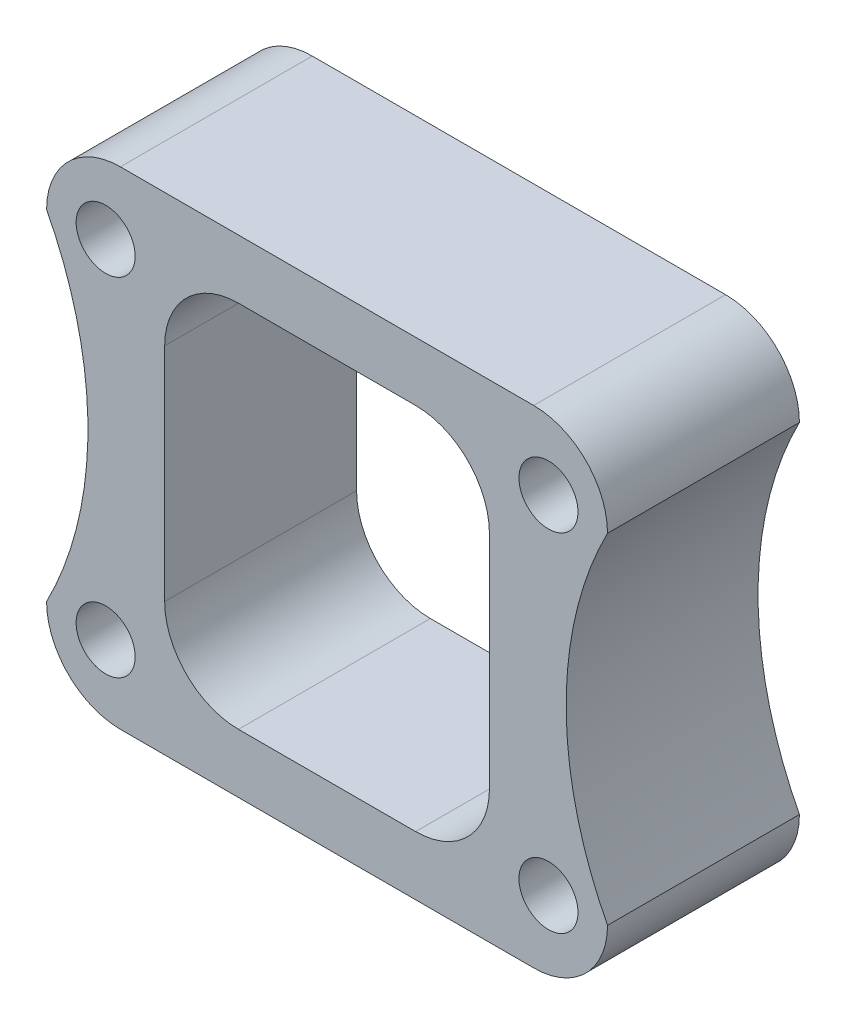
ISO-10303-21;
HEADER;
FILE_DESCRIPTION(('STEP AP214'),'2;1');
FILE_NAME('part.step','',(''),(''),'','','');
FILE_SCHEMA(('AUTOMOTIVE_DESIGN { 1 0 10303 214 1 1 1 1 }'));
ENDSEC;
DATA;
#1=APPLICATION_CONTEXT('core data for automotive mechanical design processes');
#2=APPLICATION_PROTOCOL_DEFINITION('international standard','automotive_design',2000,#1);
#3=PRODUCT_CONTEXT('',#1,'mechanical');
#4=PRODUCT('Part','Part','',(#3));
#5=PRODUCT_RELATED_PRODUCT_CATEGORY('part','',(#4));
#6=PRODUCT_DEFINITION_FORMATION('','',#4);
#7=PRODUCT_DEFINITION_CONTEXT('part definition',#1,'design');
#8=PRODUCT_DEFINITION('design','',#6,#7);
#9=PRODUCT_DEFINITION_SHAPE('','',#8);
#10=(LENGTH_UNIT() NAMED_UNIT(*) SI_UNIT(.MILLI.,.METRE.));
#11=(NAMED_UNIT(*) PLANE_ANGLE_UNIT() SI_UNIT($,.RADIAN.));
#12=(NAMED_UNIT(*) SI_UNIT($,.STERADIAN.) SOLID_ANGLE_UNIT());
#13=UNCERTAINTY_MEASURE_WITH_UNIT(LENGTH_MEASURE(1.E-05),#10,'distance_accuracy_value','');
#14=(GEOMETRIC_REPRESENTATION_CONTEXT(3) GLOBAL_UNCERTAINTY_ASSIGNED_CONTEXT((#13)) GLOBAL_UNIT_ASSIGNED_CONTEXT((#10,
#11,#12)) REPRESENTATION_CONTEXT('',''));
#15=CARTESIAN_POINT('',(0.,0.,0.));
#16=DIRECTION('',(0.,0.,1.));
#17=DIRECTION('',(1.,0.,0.));
#18=AXIS2_PLACEMENT_3D('',#15,#16,#17);
#19=CARTESIAN_POINT('',(5.,28.,13.));
#20=DIRECTION('',(0.,0.,1.));
#21=DIRECTION('',(1.,0.,0.));
#22=AXIS2_PLACEMENT_3D('',#19,#20,#21);
#23=PLANE('',#22);
#24=DIRECTION('',(0.,-1.,0.));
#25=VECTOR('',#24,1.);
#26=CARTESIAN_POINT('',(30.,3.99999999999999,13.));
#27=LINE('',#26,#25);
#28=CARTESIAN_POINT('',(30.,24.,13.));
#29=VERTEX_POINT('',#28);
#30=CARTESIAN_POINT('',(30.,8.99999999999999,13.));
#31=VERTEX_POINT('',#30);
#32=EDGE_CURVE('E229',#29,#31,#27,.T.);
#33=ORIENTED_EDGE('',*,*,#32,.T.);
#34=CARTESIAN_POINT('',(25.,8.99999999999999,13.));
#35=DIRECTION('',(0.,0.,1.));
#36=DIRECTION('',(1.,0.,0.));
#37=AXIS2_PLACEMENT_3D('',#34,#35,#36);
#38=CIRCLE('',#37,5.);
#39=CARTESIAN_POINT('',(25.,3.99999999999999,13.));
#40=VERTEX_POINT('',#39);
#41=EDGE_CURVE('E204',#31,#40,#38,.F.);
#42=ORIENTED_EDGE('',*,*,#41,.T.);
#43=DIRECTION('',(-1.,0.,0.));
#44=VECTOR('',#43,1.);
#45=CARTESIAN_POINT('',(30.,3.99999999999999,13.));
#46=LINE('',#45,#44);
#47=CARTESIAN_POINT('',(13.,4.,13.));
#48=VERTEX_POINT('',#47);
#49=EDGE_CURVE('E235',#40,#48,#46,.T.);
#50=ORIENTED_EDGE('',*,*,#49,.T.);
#51=CARTESIAN_POINT('',(13.,8.99999999999999,13.));
#52=DIRECTION('',(0.,0.,1.));
#53=DIRECTION('',(1.,0.,0.));
#54=AXIS2_PLACEMENT_3D('',#51,#52,#53);
#55=CIRCLE('',#54,5.);
#56=CARTESIAN_POINT('',(8.,8.99999999999999,13.));
#57=VERTEX_POINT('',#56);
#58=EDGE_CURVE('E200',#48,#57,#55,.F.);
#59=ORIENTED_EDGE('',*,*,#58,.T.);
#60=DIRECTION('',(0.,1.,0.));
#61=VECTOR('',#60,1.);
#62=CARTESIAN_POINT('',(8.,4.,13.));
#63=LINE('',#62,#61);
#64=CARTESIAN_POINT('',(8.,24.,13.));
#65=VERTEX_POINT('',#64);
#66=EDGE_CURVE('E230',#57,#65,#63,.T.);
#67=ORIENTED_EDGE('',*,*,#66,.T.);
#68=CARTESIAN_POINT('',(13.,24.,13.));
#69=DIRECTION('',(0.,0.,1.));
#70=DIRECTION('',(1.,0.,0.));
#71=AXIS2_PLACEMENT_3D('',#68,#69,#70);
#72=CIRCLE('',#71,5.);
#73=CARTESIAN_POINT('',(13.,29.,13.));
#74=VERTEX_POINT('',#73);
#75=EDGE_CURVE('E11',#65,#74,#72,.F.);
#76=ORIENTED_EDGE('',*,*,#75,.T.);
#77=DIRECTION('',(1.,0.,0.));
#78=VECTOR('',#77,1.);
#79=CARTESIAN_POINT('',(30.,29.,13.));
#80=LINE('',#79,#78);
#81=CARTESIAN_POINT('',(25.,29.,13.));
#82=VERTEX_POINT('',#81);
#83=EDGE_CURVE('E227',#74,#82,#80,.T.);
#84=ORIENTED_EDGE('',*,*,#83,.T.);
#85=CARTESIAN_POINT('',(25.,24.,13.));
#86=DIRECTION('',(0.,0.,1.));
#87=DIRECTION('',(1.,0.,0.));
#88=AXIS2_PLACEMENT_3D('',#85,#86,#87);
#89=CIRCLE('',#88,5.);
#90=EDGE_CURVE('E208',#82,#29,#89,.F.);
#91=ORIENTED_EDGE('',*,*,#90,.T.);
#92=EDGE_LOOP('',(#33,#42,#50,#59,#67,#76,#84,#91));
#93=FACE_BOUND('',#92,.T.);
#94=CARTESIAN_POINT('',(33.9999999999999,28.25,13.));
#95=DIRECTION('',(0.,0.,1.));
#96=DIRECTION('',(1.,0.,0.));
#97=AXIS2_PLACEMENT_3D('',#94,#95,#96);
#98=CIRCLE('',#97,2.);
#99=CARTESIAN_POINT('',(31.9999999999999,28.25,13.));
#100=VERTEX_POINT('',#99);
#101=EDGE_CURVE('E251',#100,#100,#98,.T.);
#102=ORIENTED_EDGE('',*,*,#101,.F.);
#103=EDGE_LOOP('',(#102));
#104=FACE_BOUND('',#103,.T.);
#105=CARTESIAN_POINT('',(4.,4.75,13.));
#106=DIRECTION('',(0.,0.,1.));
#107=DIRECTION('',(1.,0.,0.));
#108=AXIS2_PLACEMENT_3D('',#105,#106,#107);
#109=CIRCLE('',#108,2.);
#110=CARTESIAN_POINT('',(2.,4.75,13.));
#111=VERTEX_POINT('',#110);
#112=EDGE_CURVE('E263',#111,#111,#109,.T.);
#113=ORIENTED_EDGE('',*,*,#112,.F.);
#114=EDGE_LOOP('',(#113));
#115=FACE_BOUND('',#114,.T.);
#116=CARTESIAN_POINT('',(5.,28.,13.));
#117=DIRECTION('',(0.,0.,1.));
#118=DIRECTION('',(1.,0.,0.));
#119=AXIS2_PLACEMENT_3D('',#116,#117,#118);
#120=CIRCLE('',#119,5.);
#121=CARTESIAN_POINT('',(5.00000000000004,33.,13.));
#122=VERTEX_POINT('',#121);
#123=CARTESIAN_POINT('',(0.,28.,13.));
#124=VERTEX_POINT('',#123);
#125=EDGE_CURVE('E160',#122,#124,#120,.T.);
#126=ORIENTED_EDGE('',*,*,#125,.T.);
#127=CARTESIAN_POINT('',(-22.1979728804231,16.5,13.));
#128=DIRECTION('',(0.,0.,-1.));
#129=DIRECTION('',(-1.,0.,0.));
#130=AXIS2_PLACEMENT_3D('',#127,#128,#129);
#131=CIRCLE('',#130,25.);
#132=CARTESIAN_POINT('',(0.,5.,13.));
#133=VERTEX_POINT('',#132);
#134=EDGE_CURVE('E149',#124,#133,#131,.T.);
#135=ORIENTED_EDGE('',*,*,#134,.T.);
#136=CARTESIAN_POINT('',(5.,5.,13.));
#137=DIRECTION('',(0.,0.,1.));
#138=DIRECTION('',(-1.,0.,0.));
#139=AXIS2_PLACEMENT_3D('',#136,#137,#138);
#140=CIRCLE('',#139,5.);
#141=CARTESIAN_POINT('',(5.00000000000004,0.,13.));
#142=VERTEX_POINT('',#141);
#143=EDGE_CURVE('E159',#133,#142,#140,.T.);
#144=ORIENTED_EDGE('',*,*,#143,.T.);
#145=DIRECTION('',(1.,0.,0.));
#146=VECTOR('',#145,1.);
#147=CARTESIAN_POINT('',(5.00000000000004,0.,13.));
#148=LINE('',#147,#146);
#149=CARTESIAN_POINT('',(33.,0.,13.));
#150=VERTEX_POINT('',#149);
#151=EDGE_CURVE('E269',#142,#150,#148,.T.);
#152=ORIENTED_EDGE('',*,*,#151,.T.);
#153=CARTESIAN_POINT('',(33.,5.,13.));
#154=DIRECTION('',(0.,0.,1.));
#155=DIRECTION('',(-1.,0.,0.));
#156=AXIS2_PLACEMENT_3D('',#153,#154,#155);
#157=CIRCLE('',#156,5.);
#158=CARTESIAN_POINT('',(38.,5.00000000000004,13.));
#159=VERTEX_POINT('',#158);
#160=EDGE_CURVE('E271',#150,#159,#157,.T.);
#161=ORIENTED_EDGE('',*,*,#160,.T.);
#162=CARTESIAN_POINT('',(60.1979728804231,16.5,13.));
#163=DIRECTION('',(0.,0.,-1.));
#164=DIRECTION('',(1.,0.,0.));
#165=AXIS2_PLACEMENT_3D('',#162,#163,#164);
#166=CIRCLE('',#165,25.);
#167=CARTESIAN_POINT('',(38.,28.,13.));
#168=VERTEX_POINT('',#167);
#169=EDGE_CURVE('E273',#159,#168,#166,.T.);
#170=ORIENTED_EDGE('',*,*,#169,.T.);
#171=CARTESIAN_POINT('',(33.,28.,13.));
#172=DIRECTION('',(0.,0.,1.));
#173=DIRECTION('',(1.,0.,0.));
#174=AXIS2_PLACEMENT_3D('',#171,#172,#173);
#175=CIRCLE('',#174,5.);
#176=CARTESIAN_POINT('',(33.,33.,13.));
#177=VERTEX_POINT('',#176);
#178=EDGE_CURVE('E275',#168,#177,#175,.T.);
#179=ORIENTED_EDGE('',*,*,#178,.T.);
#180=DIRECTION('',(-1.,0.,0.));
#181=VECTOR('',#180,1.);
#182=CARTESIAN_POINT('',(5.00000000000004,33.,13.));
#183=LINE('',#182,#181);
#184=EDGE_CURVE('E165',#177,#122,#183,.T.);
#185=ORIENTED_EDGE('',*,*,#184,.T.);
#186=EDGE_LOOP('',(#126,#135,#144,#152,#161,#170,#179,#185));
#187=FACE_BOUND('',#186,.T.);
#188=CARTESIAN_POINT('',(34.,4.75,13.));
#189=DIRECTION('',(0.,0.,1.));
#190=DIRECTION('',(1.,0.,0.));
#191=AXIS2_PLACEMENT_3D('',#188,#189,#190);
#192=CIRCLE('',#191,2.);
#193=CARTESIAN_POINT('',(32.,4.75,13.));
#194=VERTEX_POINT('',#193);
#195=EDGE_CURVE('E257',#194,#194,#192,.T.);
#196=ORIENTED_EDGE('',*,*,#195,.F.);
#197=EDGE_LOOP('',(#196));
#198=FACE_BOUND('',#197,.T.);
#199=CARTESIAN_POINT('',(3.99999999999992,28.25,13.));
#200=DIRECTION('',(0.,0.,1.));
#201=DIRECTION('',(1.,0.,0.));
#202=AXIS2_PLACEMENT_3D('',#199,#200,#201);
#203=CIRCLE('',#202,2.);
#204=CARTESIAN_POINT('',(1.99999999999992,28.25,13.));
#205=VERTEX_POINT('',#204);
#206=EDGE_CURVE('E245',#205,#205,#203,.T.);
#207=ORIENTED_EDGE('',*,*,#206,.F.);
#208=EDGE_LOOP('',(#207));
#209=FACE_BOUND('',#208,.T.);
#210=ADVANCED_FACE('F36',(#93,#104,#115,#187,#198,#209),#23,.T.);
#211=CARTESIAN_POINT('',(5.,28.,0.));
#212=DIRECTION('',(0.,0.,1.));
#213=DIRECTION('',(1.,0.,0.));
#214=AXIS2_PLACEMENT_3D('',#211,#212,#213);
#215=PLANE('',#214);
#216=DIRECTION('',(0.,1.,0.));
#217=VECTOR('',#216,1.);
#218=CARTESIAN_POINT('',(8.,4.,0.));
#219=LINE('',#218,#217);
#220=CARTESIAN_POINT('',(8.,8.99999999999999,0.));
#221=VERTEX_POINT('',#220);
#222=CARTESIAN_POINT('',(8.,24.,0.));
#223=VERTEX_POINT('',#222);
#224=EDGE_CURVE('E215',#221,#223,#219,.T.);
#225=ORIENTED_EDGE('',*,*,#224,.F.);
#226=CARTESIAN_POINT('',(13.,8.99999999999999,0.));
#227=DIRECTION('',(0.,0.,1.));
#228=DIRECTION('',(1.,0.,0.));
#229=AXIS2_PLACEMENT_3D('',#226,#227,#228);
#230=CIRCLE('',#229,5.);
#231=CARTESIAN_POINT('',(13.,4.,0.));
#232=VERTEX_POINT('',#231);
#233=EDGE_CURVE('E198',#221,#232,#230,.T.);
#234=ORIENTED_EDGE('',*,*,#233,.T.);
#235=DIRECTION('',(-1.,0.,0.));
#236=VECTOR('',#235,1.);
#237=CARTESIAN_POINT('',(30.,3.99999999999999,0.));
#238=LINE('',#237,#236);
#239=CARTESIAN_POINT('',(25.,3.99999999999999,0.));
#240=VERTEX_POINT('',#239);
#241=EDGE_CURVE('E224',#240,#232,#238,.T.);
#242=ORIENTED_EDGE('',*,*,#241,.F.);
#243=CARTESIAN_POINT('',(25.,8.99999999999999,0.));
#244=DIRECTION('',(0.,0.,1.));
#245=DIRECTION('',(1.,0.,0.));
#246=AXIS2_PLACEMENT_3D('',#243,#244,#245);
#247=CIRCLE('',#246,5.);
#248=CARTESIAN_POINT('',(30.,8.99999999999999,0.));
#249=VERTEX_POINT('',#248);
#250=EDGE_CURVE('E202',#240,#249,#247,.T.);
#251=ORIENTED_EDGE('',*,*,#250,.T.);
#252=DIRECTION('',(0.,-1.,0.));
#253=VECTOR('',#252,1.);
#254=CARTESIAN_POINT('',(30.,3.99999999999999,0.));
#255=LINE('',#254,#253);
#256=CARTESIAN_POINT('',(30.,24.,0.));
#257=VERTEX_POINT('',#256);
#258=EDGE_CURVE('E242',#257,#249,#255,.T.);
#259=ORIENTED_EDGE('',*,*,#258,.F.);
#260=CARTESIAN_POINT('',(25.,24.,0.));
#261=DIRECTION('',(0.,0.,1.));
#262=DIRECTION('',(1.,0.,0.));
#263=AXIS2_PLACEMENT_3D('',#260,#261,#262);
#264=CIRCLE('',#263,5.);
#265=CARTESIAN_POINT('',(25.,29.,0.));
#266=VERTEX_POINT('',#265);
#267=EDGE_CURVE('E206',#257,#266,#264,.T.);
#268=ORIENTED_EDGE('',*,*,#267,.T.);
#269=DIRECTION('',(1.,0.,0.));
#270=VECTOR('',#269,1.);
#271=CARTESIAN_POINT('',(30.,29.,0.));
#272=LINE('',#271,#270);
#273=CARTESIAN_POINT('',(13.,29.,0.));
#274=VERTEX_POINT('',#273);
#275=EDGE_CURVE('E216',#274,#266,#272,.T.);
#276=ORIENTED_EDGE('',*,*,#275,.F.);
#277=CARTESIAN_POINT('',(13.,24.,0.));
#278=DIRECTION('',(0.,0.,1.));
#279=DIRECTION('',(1.,0.,0.));
#280=AXIS2_PLACEMENT_3D('',#277,#278,#279);
#281=CIRCLE('',#280,5.);
#282=EDGE_CURVE('E44',#274,#223,#281,.T.);
#283=ORIENTED_EDGE('',*,*,#282,.T.);
#284=EDGE_LOOP('',(#225,#234,#242,#251,#259,#268,#276,#283));
#285=FACE_BOUND('',#284,.T.);
#286=CARTESIAN_POINT('',(5.,28.,0.));
#287=DIRECTION('',(0.,0.,1.));
#288=DIRECTION('',(1.,0.,0.));
#289=AXIS2_PLACEMENT_3D('',#286,#287,#288);
#290=CIRCLE('',#289,5.);
#291=CARTESIAN_POINT('',(5.00000000000004,33.,0.));
#292=VERTEX_POINT('',#291);
#293=CARTESIAN_POINT('',(0.,28.,0.));
#294=VERTEX_POINT('',#293);
#295=EDGE_CURVE('E173',#292,#294,#290,.T.);
#296=ORIENTED_EDGE('',*,*,#295,.F.);
#297=DIRECTION('',(-1.,0.,0.));
#298=VECTOR('',#297,1.);
#299=CARTESIAN_POINT('',(5.00000000000004,33.,0.));
#300=LINE('',#299,#298);
#301=CARTESIAN_POINT('',(33.,33.,0.));
#302=VERTEX_POINT('',#301);
#303=EDGE_CURVE('E169',#302,#292,#300,.T.);
#304=ORIENTED_EDGE('',*,*,#303,.F.);
#305=CARTESIAN_POINT('',(33.,28.,0.));
#306=DIRECTION('',(0.,0.,1.));
#307=DIRECTION('',(1.,0.,0.));
#308=AXIS2_PLACEMENT_3D('',#305,#306,#307);
#309=CIRCLE('',#308,5.);
#310=CARTESIAN_POINT('',(38.,28.,0.));
#311=VERTEX_POINT('',#310);
#312=EDGE_CURVE('E290',#311,#302,#309,.T.);
#313=ORIENTED_EDGE('',*,*,#312,.F.);
#314=CARTESIAN_POINT('',(60.1979728804231,16.5,0.));
#315=DIRECTION('',(0.,0.,-1.));
#316=DIRECTION('',(1.,0.,0.));
#317=AXIS2_PLACEMENT_3D('',#314,#315,#316);
#318=CIRCLE('',#317,25.);
#319=CARTESIAN_POINT('',(38.,5.00000000000004,0.));
#320=VERTEX_POINT('',#319);
#321=EDGE_CURVE('E288',#320,#311,#318,.T.);
#322=ORIENTED_EDGE('',*,*,#321,.F.);
#323=CARTESIAN_POINT('',(33.,5.,0.));
#324=DIRECTION('',(0.,0.,1.));
#325=DIRECTION('',(-1.,0.,0.));
#326=AXIS2_PLACEMENT_3D('',#323,#324,#325);
#327=CIRCLE('',#326,5.);
#328=CARTESIAN_POINT('',(33.,0.,0.));
#329=VERTEX_POINT('',#328);
#330=EDGE_CURVE('E286',#329,#320,#327,.T.);
#331=ORIENTED_EDGE('',*,*,#330,.F.);
#332=DIRECTION('',(1.,0.,0.));
#333=VECTOR('',#332,1.);
#334=CARTESIAN_POINT('',(5.00000000000004,0.,0.));
#335=LINE('',#334,#333);
#336=CARTESIAN_POINT('',(5.00000000000004,0.,0.));
#337=VERTEX_POINT('',#336);
#338=EDGE_CURVE('E284',#337,#329,#335,.T.);
#339=ORIENTED_EDGE('',*,*,#338,.F.);
#340=CARTESIAN_POINT('',(5.,5.,0.));
#341=DIRECTION('',(0.,0.,1.));
#342=DIRECTION('',(-1.,0.,0.));
#343=AXIS2_PLACEMENT_3D('',#340,#341,#342);
#344=CIRCLE('',#343,5.);
#345=CARTESIAN_POINT('',(0.,5.,0.));
#346=VERTEX_POINT('',#345);
#347=EDGE_CURVE('E282',#346,#337,#344,.T.);
#348=ORIENTED_EDGE('',*,*,#347,.F.);
#349=CARTESIAN_POINT('',(-22.1979728804231,16.5,0.));
#350=DIRECTION('',(0.,0.,-1.));
#351=DIRECTION('',(-1.,0.,0.));
#352=AXIS2_PLACEMENT_3D('',#349,#350,#351);
#353=CIRCLE('',#352,25.);
#354=EDGE_CURVE('E280',#294,#346,#353,.T.);
#355=ORIENTED_EDGE('',*,*,#354,.F.);
#356=EDGE_LOOP('',(#296,#304,#313,#322,#331,#339,#348,#355));
#357=FACE_BOUND('',#356,.T.);
#358=CARTESIAN_POINT('',(4.,4.75,0.));
#359=DIRECTION('',(0.,0.,1.));
#360=DIRECTION('',(1.,0.,0.));
#361=AXIS2_PLACEMENT_3D('',#358,#359,#360);
#362=CIRCLE('',#361,2.);
#363=CARTESIAN_POINT('',(2.,4.75,0.));
#364=VERTEX_POINT('',#363);
#365=EDGE_CURVE('E260',#364,#364,#362,.T.);
#366=ORIENTED_EDGE('',*,*,#365,.T.);
#367=EDGE_LOOP('',(#366));
#368=FACE_BOUND('',#367,.T.);
#369=CARTESIAN_POINT('',(34.,4.75,0.));
#370=DIRECTION('',(0.,0.,1.));
#371=DIRECTION('',(1.,0.,0.));
#372=AXIS2_PLACEMENT_3D('',#369,#370,#371);
#373=CIRCLE('',#372,2.);
#374=CARTESIAN_POINT('',(32.,4.75,0.));
#375=VERTEX_POINT('',#374);
#376=EDGE_CURVE('E254',#375,#375,#373,.T.);
#377=ORIENTED_EDGE('',*,*,#376,.T.);
#378=EDGE_LOOP('',(#377));
#379=FACE_BOUND('',#378,.T.);
#380=CARTESIAN_POINT('',(33.9999999999999,28.25,0.));
#381=DIRECTION('',(0.,0.,1.));
#382=DIRECTION('',(1.,0.,0.));
#383=AXIS2_PLACEMENT_3D('',#380,#381,#382);
#384=CIRCLE('',#383,2.);
#385=CARTESIAN_POINT('',(31.9999999999999,28.25,0.));
#386=VERTEX_POINT('',#385);
#387=EDGE_CURVE('E248',#386,#386,#384,.T.);
#388=ORIENTED_EDGE('',*,*,#387,.T.);
#389=EDGE_LOOP('',(#388));
#390=FACE_BOUND('',#389,.T.);
#391=CARTESIAN_POINT('',(3.99999999999992,28.25,0.));
#392=DIRECTION('',(0.,0.,1.));
#393=DIRECTION('',(1.,0.,0.));
#394=AXIS2_PLACEMENT_3D('',#391,#392,#393);
#395=CIRCLE('',#394,2.);
#396=CARTESIAN_POINT('',(1.99999999999992,28.25,0.));
#397=VERTEX_POINT('',#396);
#398=EDGE_CURVE('E233',#397,#397,#395,.T.);
#399=ORIENTED_EDGE('',*,*,#398,.T.);
#400=EDGE_LOOP('',(#399));
#401=FACE_BOUND('',#400,.T.);
#402=ADVANCED_FACE('F213',(#285,#357,#368,#379,#390,#401),#215,.F.);
#403=CARTESIAN_POINT('',(5.,28.,13.));
#404=DIRECTION('',(0.,0.,-1.));
#405=DIRECTION('',(-1.,0.,0.));
#406=AXIS2_PLACEMENT_3D('',#403,#404,#405);
#407=CYLINDRICAL_SURFACE('',#406,5.);
#408=ORIENTED_EDGE('',*,*,#295,.T.);
#409=DIRECTION('',(0.,0.,-1.));
#410=VECTOR('',#409,1.);
#411=CARTESIAN_POINT('',(0.,28.,13.));
#412=LINE('',#411,#410);
#413=EDGE_CURVE('E153',#124,#294,#412,.T.);
#414=ORIENTED_EDGE('',*,*,#413,.F.);
#415=ORIENTED_EDGE('',*,*,#125,.F.);
#416=DIRECTION('',(0.,0.,-1.));
#417=VECTOR('',#416,1.);
#418=CARTESIAN_POINT('',(5.00000000000004,33.,13.));
#419=LINE('',#418,#417);
#420=EDGE_CURVE('E278',#122,#292,#419,.T.);
#421=ORIENTED_EDGE('',*,*,#420,.T.);
#422=EDGE_LOOP('',(#408,#414,#415,#421));
#423=FACE_BOUND('',#422,.T.);
#424=ADVANCED_FACE('F171',(#423),#407,.T.);
#425=CARTESIAN_POINT('',(-22.1979728804231,16.5,13.));
#426=DIRECTION('',(0.,0.,-1.));
#427=DIRECTION('',(-1.,0.,0.));
#428=AXIS2_PLACEMENT_3D('',#425,#426,#427);
#429=CYLINDRICAL_SURFACE('',#428,25.);
#430=ORIENTED_EDGE('',*,*,#354,.T.);
#431=DIRECTION('',(0.,0.,-1.));
#432=VECTOR('',#431,1.);
#433=CARTESIAN_POINT('',(0.,5.,13.));
#434=LINE('',#433,#432);
#435=EDGE_CURVE('E156',#133,#346,#434,.T.);
#436=ORIENTED_EDGE('',*,*,#435,.F.);
#437=ORIENTED_EDGE('',*,*,#134,.F.);
#438=ORIENTED_EDGE('',*,*,#413,.T.);
#439=EDGE_LOOP('',(#430,#436,#437,#438));
#440=FACE_BOUND('',#439,.T.);
#441=ADVANCED_FACE('F151',(#440),#429,.F.);
#442=CARTESIAN_POINT('',(5.,5.,13.));
#443=DIRECTION('',(0.,0.,-1.));
#444=DIRECTION('',(-1.,0.,0.));
#445=AXIS2_PLACEMENT_3D('',#442,#443,#444);
#446=CYLINDRICAL_SURFACE('',#445,5.);
#447=ORIENTED_EDGE('',*,*,#347,.T.);
#448=DIRECTION('',(0.,0.,-1.));
#449=VECTOR('',#448,1.);
#450=CARTESIAN_POINT('',(5.00000000000004,0.,13.));
#451=LINE('',#450,#449);
#452=EDGE_CURVE('E178',#142,#337,#451,.T.);
#453=ORIENTED_EDGE('',*,*,#452,.F.);
#454=ORIENTED_EDGE('',*,*,#143,.F.);
#455=ORIENTED_EDGE('',*,*,#435,.T.);
#456=EDGE_LOOP('',(#447,#453,#454,#455));
#457=FACE_BOUND('',#456,.T.);
#458=ADVANCED_FACE('F328',(#457),#446,.T.);
#459=CARTESIAN_POINT('',(5.00000000000004,0.,13.));
#460=DIRECTION('',(0.,1.,0.));
#461=DIRECTION('',(0.,0.,1.));
#462=AXIS2_PLACEMENT_3D('',#459,#460,#461);
#463=PLANE('',#462);
#464=ORIENTED_EDGE('',*,*,#338,.T.);
#465=DIRECTION('',(0.,0.,-1.));
#466=VECTOR('',#465,1.);
#467=CARTESIAN_POINT('',(33.,0.,13.));
#468=LINE('',#467,#466);
#469=EDGE_CURVE('E303',#150,#329,#468,.T.);
#470=ORIENTED_EDGE('',*,*,#469,.F.);
#471=ORIENTED_EDGE('',*,*,#151,.F.);
#472=ORIENTED_EDGE('',*,*,#452,.T.);
#473=EDGE_LOOP('',(#464,#470,#471,#472));
#474=FACE_BOUND('',#473,.T.);
#475=ADVANCED_FACE('F310',(#474),#463,.F.);
#476=CARTESIAN_POINT('',(33.,5.,13.));
#477=DIRECTION('',(0.,0.,-1.));
#478=DIRECTION('',(-1.,0.,0.));
#479=AXIS2_PLACEMENT_3D('',#476,#477,#478);
#480=CYLINDRICAL_SURFACE('',#479,5.);
#481=ORIENTED_EDGE('',*,*,#330,.T.);
#482=DIRECTION('',(0.,0.,-1.));
#483=VECTOR('',#482,1.);
#484=CARTESIAN_POINT('',(38.,5.00000000000004,13.));
#485=LINE('',#484,#483);
#486=EDGE_CURVE('E300',#159,#320,#485,.T.);
#487=ORIENTED_EDGE('',*,*,#486,.F.);
#488=ORIENTED_EDGE('',*,*,#160,.F.);
#489=ORIENTED_EDGE('',*,*,#469,.T.);
#490=EDGE_LOOP('',(#481,#487,#488,#489));
#491=FACE_BOUND('',#490,.T.);
#492=ADVANCED_FACE('F320',(#491),#480,.T.);
#493=CARTESIAN_POINT('',(60.1979728804231,16.5,13.));
#494=DIRECTION('',(0.,0.,-1.));
#495=DIRECTION('',(-1.,0.,0.));
#496=AXIS2_PLACEMENT_3D('',#493,#494,#495);
#497=CYLINDRICAL_SURFACE('',#496,25.);
#498=ORIENTED_EDGE('',*,*,#321,.T.);
#499=DIRECTION('',(0.,0.,-1.));
#500=VECTOR('',#499,1.);
#501=CARTESIAN_POINT('',(38.,28.,13.));
#502=LINE('',#501,#500);
#503=EDGE_CURVE('E297',#168,#311,#502,.T.);
#504=ORIENTED_EDGE('',*,*,#503,.F.);
#505=ORIENTED_EDGE('',*,*,#169,.F.);
#506=ORIENTED_EDGE('',*,*,#486,.T.);
#507=EDGE_LOOP('',(#498,#504,#505,#506));
#508=FACE_BOUND('',#507,.T.);
#509=ADVANCED_FACE('F324',(#508),#497,.F.);
#510=CARTESIAN_POINT('',(33.,28.,13.));
#511=DIRECTION('',(0.,0.,-1.));
#512=DIRECTION('',(-1.,0.,0.));
#513=AXIS2_PLACEMENT_3D('',#510,#511,#512);
#514=CYLINDRICAL_SURFACE('',#513,5.);
#515=ORIENTED_EDGE('',*,*,#312,.T.);
#516=DIRECTION('',(0.,0.,-1.));
#517=VECTOR('',#516,1.);
#518=CARTESIAN_POINT('',(33.,33.,13.));
#519=LINE('',#518,#517);
#520=EDGE_CURVE('E294',#177,#302,#519,.T.);
#521=ORIENTED_EDGE('',*,*,#520,.F.);
#522=ORIENTED_EDGE('',*,*,#178,.F.);
#523=ORIENTED_EDGE('',*,*,#503,.T.);
#524=EDGE_LOOP('',(#515,#521,#522,#523));
#525=FACE_BOUND('',#524,.T.);
#526=ADVANCED_FACE('F351',(#525),#514,.T.);
#527=CARTESIAN_POINT('',(5.00000000000004,33.,13.));
#528=DIRECTION('',(0.,-1.,0.));
#529=DIRECTION('',(0.,0.,-1.));
#530=AXIS2_PLACEMENT_3D('',#527,#528,#529);
#531=PLANE('',#530);
#532=ORIENTED_EDGE('',*,*,#303,.T.);
#533=ORIENTED_EDGE('',*,*,#420,.F.);
#534=ORIENTED_EDGE('',*,*,#184,.F.);
#535=ORIENTED_EDGE('',*,*,#520,.T.);
#536=EDGE_LOOP('',(#532,#533,#534,#535));
#537=FACE_BOUND('',#536,.T.);
#538=ADVANCED_FACE('F348',(#537),#531,.F.);
#539=CARTESIAN_POINT('',(4.,4.75,13.));
#540=DIRECTION('',(0.,0.,-1.));
#541=DIRECTION('',(-1.,0.,0.));
#542=AXIS2_PLACEMENT_3D('',#539,#540,#541);
#543=CYLINDRICAL_SURFACE('',#542,2.);
#544=CARTESIAN_POINT('',(2.,4.75,13.));
#545=CARTESIAN_POINT('',(2.,4.75,12.8645833333333));
#546=CARTESIAN_POINT('',(2.,4.75,12.7291666666667));
#547=CARTESIAN_POINT('',(2.,4.75,12.4583333333333));
#548=CARTESIAN_POINT('',(2.,4.75,12.3229166666667));
#549=CARTESIAN_POINT('',(2.,4.75,12.0520833333333));
#550=CARTESIAN_POINT('',(2.,4.75,11.9166666666667));
#551=CARTESIAN_POINT('',(2.,4.75,11.6458333333333));
#552=CARTESIAN_POINT('',(2.,4.75,11.5104166666667));
#553=CARTESIAN_POINT('',(2.,4.75,11.2395833333333));
#554=CARTESIAN_POINT('',(2.,4.75,11.1041666666667));
#555=CARTESIAN_POINT('',(2.,4.75,10.8333333333333));
#556=CARTESIAN_POINT('',(2.,4.75,10.6979166666667));
#557=CARTESIAN_POINT('',(2.,4.75,10.4270833333333));
#558=CARTESIAN_POINT('',(2.,4.75,10.2916666666667));
#559=CARTESIAN_POINT('',(2.,4.75,10.0208333333333));
#560=CARTESIAN_POINT('',(2.,4.75,9.88541666666667));
#561=CARTESIAN_POINT('',(2.,4.75,9.61458333333333));
#562=CARTESIAN_POINT('',(2.,4.75,9.47916666666667));
#563=CARTESIAN_POINT('',(2.,4.75,9.20833333333333));
#564=CARTESIAN_POINT('',(2.,4.75,9.07291666666666));
#565=CARTESIAN_POINT('',(2.,4.75,8.80208333333333));
#566=CARTESIAN_POINT('',(2.,4.75,8.66666666666667));
#567=CARTESIAN_POINT('',(2.,4.75,8.39583333333333));
#568=CARTESIAN_POINT('',(2.,4.75,8.26041666666667));
#569=CARTESIAN_POINT('',(2.,4.75,7.98958333333333));
#570=CARTESIAN_POINT('',(2.,4.75,7.85416666666667));
#571=CARTESIAN_POINT('',(2.,4.75,7.58333333333333));
#572=CARTESIAN_POINT('',(2.,4.75,7.44791666666667));
#573=CARTESIAN_POINT('',(2.,4.75,7.17708333333333));
#574=CARTESIAN_POINT('',(2.,4.75,7.04166666666667));
#575=CARTESIAN_POINT('',(2.,4.75,6.77083333333333));
#576=CARTESIAN_POINT('',(2.,4.75,6.63541666666667));
#577=CARTESIAN_POINT('',(2.,4.75,6.36458333333333));
#578=CARTESIAN_POINT('',(2.,4.75,6.22916666666667));
#579=CARTESIAN_POINT('',(2.,4.75,5.95833333333333));
#580=CARTESIAN_POINT('',(2.,4.75,5.82291666666667));
#581=CARTESIAN_POINT('',(2.,4.75,5.55208333333333));
#582=CARTESIAN_POINT('',(2.,4.75,5.41666666666667));
#583=CARTESIAN_POINT('',(2.,4.75,5.14583333333333));
#584=CARTESIAN_POINT('',(2.,4.75,5.01041666666667));
#585=CARTESIAN_POINT('',(2.,4.75,4.73958333333333));
#586=CARTESIAN_POINT('',(2.,4.75,4.60416666666667));
#587=CARTESIAN_POINT('',(2.,4.75,4.33333333333333));
#588=CARTESIAN_POINT('',(2.,4.75,4.19791666666667));
#589=CARTESIAN_POINT('',(2.,4.75,3.92708333333333));
#590=CARTESIAN_POINT('',(2.,4.75,3.79166666666667));
#591=CARTESIAN_POINT('',(2.,4.75,3.52083333333333));
#592=CARTESIAN_POINT('',(2.,4.75,3.38541666666667));
#593=CARTESIAN_POINT('',(2.,4.75,3.11458333333333));
#594=CARTESIAN_POINT('',(2.,4.75,2.97916666666667));
#595=CARTESIAN_POINT('',(2.,4.75,2.70833333333333));
#596=CARTESIAN_POINT('',(2.,4.75,2.57291666666667));
#597=CARTESIAN_POINT('',(2.,4.75,2.30208333333333));
#598=CARTESIAN_POINT('',(2.,4.75,2.16666666666667));
#599=CARTESIAN_POINT('',(2.,4.75,1.89583333333333));
#600=CARTESIAN_POINT('',(2.,4.75,1.76041666666667));
#601=CARTESIAN_POINT('',(2.,4.75,1.48958333333333));
#602=CARTESIAN_POINT('',(2.,4.75,1.35416666666667));
#603=CARTESIAN_POINT('',(2.,4.75,1.08333333333333));
#604=CARTESIAN_POINT('',(2.,4.75,0.947916666666667));
#605=CARTESIAN_POINT('',(2.,4.75,0.677083333333334));
#606=CARTESIAN_POINT('',(2.,4.75,0.541666666666667));
#607=CARTESIAN_POINT('',(2.,4.75,0.270833333333334));
#608=CARTESIAN_POINT('',(2.,4.75,0.135416666666667));
#609=CARTESIAN_POINT('',(2.,4.75,0.));
#610=B_SPLINE_CURVE_WITH_KNOTS('',3,(#544,#545,#546,#547,#548,#549,#550,#551,#552,#553,#554,
#555,#556,#557,#558,#559,#560,#561,#562,#563,#564,#565,#566,#567,#568,#569,#570,#571,#572,#573,
#574,#575,#576,#577,#578,#579,#580,#581,#582,#583,#584,#585,#586,#587,#588,#589,#590,#591,#592,
#593,#594,#595,#596,#597,#598,#599,#600,#601,#602,#603,#604,#605,#606,#607,#608,#609),
.UNSPECIFIED.,.F.,.F.,(4,2,2,2,2,2,2,2,2,2,2,2,2,2,2,2,2,2,2,2,2,2,2,2,2,2,2,2,2,2,2,2,4),(0.,
0.40625,0.812500000000001,1.21875,1.625,2.03125,2.4375,2.84375,3.25,3.65625,4.0625,4.46875,
4.875,5.28125,5.6875,6.09375,6.5,6.90625,7.3125,7.71875,8.125,8.53125,8.9375,9.34375,9.75,
10.15625,10.5625,10.96875,11.375,11.78125,12.1875,12.59375,13.),.UNSPECIFIED.);
#611=EDGE_CURVE('BSEAM345',#111,#364,#610,.T.);
#612=ORIENTED_EDGE('',*,*,#112,.T.);
#613=ORIENTED_EDGE('',*,*,#365,.F.);
#614=ORIENTED_EDGE('',*,*,#611,.T.);
#615=ORIENTED_EDGE('',*,*,#611,.F.);
#616=EDGE_LOOP('',(#612,#614,#613,#615));
#617=FACE_BOUND('',#616,.T.);
#618=ADVANCED_FACE('F345',(#617),#543,.F.);
#619=CARTESIAN_POINT('',(34.,4.75,13.));
#620=DIRECTION('',(0.,0.,-1.));
#621=DIRECTION('',(-1.,0.,0.));
#622=AXIS2_PLACEMENT_3D('',#619,#620,#621);
#623=CYLINDRICAL_SURFACE('',#622,2.);
#624=CARTESIAN_POINT('',(32.,4.75,13.));
#625=CARTESIAN_POINT('',(32.,4.75,12.8645833333333));
#626=CARTESIAN_POINT('',(32.,4.75,12.7291666666667));
#627=CARTESIAN_POINT('',(32.,4.75,12.4583333333333));
#628=CARTESIAN_POINT('',(32.,4.75,12.3229166666667));
#629=CARTESIAN_POINT('',(32.,4.75,12.0520833333333));
#630=CARTESIAN_POINT('',(32.,4.75,11.9166666666667));
#631=CARTESIAN_POINT('',(32.,4.75,11.6458333333333));
#632=CARTESIAN_POINT('',(32.,4.75,11.5104166666667));
#633=CARTESIAN_POINT('',(32.,4.75,11.2395833333333));
#634=CARTESIAN_POINT('',(32.,4.75,11.1041666666667));
#635=CARTESIAN_POINT('',(32.,4.75,10.8333333333333));
#636=CARTESIAN_POINT('',(32.,4.75,10.6979166666667));
#637=CARTESIAN_POINT('',(32.,4.75,10.4270833333333));
#638=CARTESIAN_POINT('',(32.,4.75,10.2916666666667));
#639=CARTESIAN_POINT('',(32.,4.75,10.0208333333333));
#640=CARTESIAN_POINT('',(32.,4.75,9.88541666666667));
#641=CARTESIAN_POINT('',(32.,4.75,9.61458333333333));
#642=CARTESIAN_POINT('',(32.,4.75,9.47916666666667));
#643=CARTESIAN_POINT('',(32.,4.75,9.20833333333333));
#644=CARTESIAN_POINT('',(32.,4.75,9.07291666666666));
#645=CARTESIAN_POINT('',(32.,4.75,8.80208333333333));
#646=CARTESIAN_POINT('',(32.,4.75,8.66666666666667));
#647=CARTESIAN_POINT('',(32.,4.75,8.39583333333333));
#648=CARTESIAN_POINT('',(32.,4.75,8.26041666666667));
#649=CARTESIAN_POINT('',(32.,4.75,7.98958333333333));
#650=CARTESIAN_POINT('',(32.,4.75,7.85416666666667));
#651=CARTESIAN_POINT('',(32.,4.75,7.58333333333333));
#652=CARTESIAN_POINT('',(32.,4.75,7.44791666666667));
#653=CARTESIAN_POINT('',(32.,4.75,7.17708333333333));
#654=CARTESIAN_POINT('',(32.,4.75,7.04166666666667));
#655=CARTESIAN_POINT('',(32.,4.75,6.77083333333333));
#656=CARTESIAN_POINT('',(32.,4.75,6.63541666666667));
#657=CARTESIAN_POINT('',(32.,4.75,6.36458333333333));
#658=CARTESIAN_POINT('',(32.,4.75,6.22916666666667));
#659=CARTESIAN_POINT('',(32.,4.75,5.95833333333333));
#660=CARTESIAN_POINT('',(32.,4.75,5.82291666666667));
#661=CARTESIAN_POINT('',(32.,4.75,5.55208333333333));
#662=CARTESIAN_POINT('',(32.,4.75,5.41666666666667));
#663=CARTESIAN_POINT('',(32.,4.75,5.14583333333333));
#664=CARTESIAN_POINT('',(32.,4.75,5.01041666666667));
#665=CARTESIAN_POINT('',(32.,4.75,4.73958333333333));
#666=CARTESIAN_POINT('',(32.,4.75,4.60416666666667));
#667=CARTESIAN_POINT('',(32.,4.75,4.33333333333333));
#668=CARTESIAN_POINT('',(32.,4.75,4.19791666666667));
#669=CARTESIAN_POINT('',(32.,4.75,3.92708333333333));
#670=CARTESIAN_POINT('',(32.,4.75,3.79166666666667));
#671=CARTESIAN_POINT('',(32.,4.75,3.52083333333333));
#672=CARTESIAN_POINT('',(32.,4.75,3.38541666666667));
#673=CARTESIAN_POINT('',(32.,4.75,3.11458333333333));
#674=CARTESIAN_POINT('',(32.,4.75,2.97916666666667));
#675=CARTESIAN_POINT('',(32.,4.75,2.70833333333333));
#676=CARTESIAN_POINT('',(32.,4.75,2.57291666666667));
#677=CARTESIAN_POINT('',(32.,4.75,2.30208333333333));
#678=CARTESIAN_POINT('',(32.,4.75,2.16666666666667));
#679=CARTESIAN_POINT('',(32.,4.75,1.89583333333333));
#680=CARTESIAN_POINT('',(32.,4.75,1.76041666666667));
#681=CARTESIAN_POINT('',(32.,4.75,1.48958333333333));
#682=CARTESIAN_POINT('',(32.,4.75,1.35416666666667));
#683=CARTESIAN_POINT('',(32.,4.75,1.08333333333333));
#684=CARTESIAN_POINT('',(32.,4.75,0.947916666666667));
#685=CARTESIAN_POINT('',(32.,4.75,0.677083333333334));
#686=CARTESIAN_POINT('',(32.,4.75,0.541666666666667));
#687=CARTESIAN_POINT('',(32.,4.75,0.270833333333334));
#688=CARTESIAN_POINT('',(32.,4.75,0.135416666666667));
#689=CARTESIAN_POINT('',(32.,4.75,0.));
#690=B_SPLINE_CURVE_WITH_KNOTS('',3,(#624,#625,#626,#627,#628,#629,#630,#631,#632,#633,#634,
#635,#636,#637,#638,#639,#640,#641,#642,#643,#644,#645,#646,#647,#648,#649,#650,#651,#652,#653,
#654,#655,#656,#657,#658,#659,#660,#661,#662,#663,#664,#665,#666,#667,#668,#669,#670,#671,#672,
#673,#674,#675,#676,#677,#678,#679,#680,#681,#682,#683,#684,#685,#686,#687,#688,#689),
.UNSPECIFIED.,.F.,.F.,(4,2,2,2,2,2,2,2,2,2,2,2,2,2,2,2,2,2,2,2,2,2,2,2,2,2,2,2,2,2,2,2,4),(0.,
0.40625,0.812500000000001,1.21875,1.625,2.03125,2.4375,2.84375,3.25,3.65625,4.0625,4.46875,
4.875,5.28125,5.6875,6.09375,6.5,6.90625,7.3125,7.71875,8.125,8.53125,8.9375,9.34375,9.75,
10.15625,10.5625,10.96875,11.375,11.78125,12.1875,12.59375,13.),.UNSPECIFIED.);
#691=EDGE_CURVE('BSEAM381',#194,#375,#690,.T.);
#692=ORIENTED_EDGE('',*,*,#195,.T.);
#693=ORIENTED_EDGE('',*,*,#376,.F.);
#694=ORIENTED_EDGE('',*,*,#691,.T.);
#695=ORIENTED_EDGE('',*,*,#691,.F.);
#696=EDGE_LOOP('',(#692,#694,#693,#695));
#697=FACE_BOUND('',#696,.T.);
#698=ADVANCED_FACE('F381',(#697),#623,.F.);
#699=CARTESIAN_POINT('',(33.9999999999999,28.25,13.));
#700=DIRECTION('',(0.,0.,-1.));
#701=DIRECTION('',(-1.,0.,0.));
#702=AXIS2_PLACEMENT_3D('',#699,#700,#701);
#703=CYLINDRICAL_SURFACE('',#702,2.);
#704=CARTESIAN_POINT('',(31.9999999999999,28.25,13.));
#705=CARTESIAN_POINT('',(31.9999999999999,28.25,12.8645833333333));
#706=CARTESIAN_POINT('',(31.9999999999999,28.25,12.7291666666667));
#707=CARTESIAN_POINT('',(31.9999999999999,28.25,12.4583333333333));
#708=CARTESIAN_POINT('',(31.9999999999999,28.25,12.3229166666667));
#709=CARTESIAN_POINT('',(31.9999999999999,28.25,12.0520833333333));
#710=CARTESIAN_POINT('',(31.9999999999999,28.25,11.9166666666667));
#711=CARTESIAN_POINT('',(31.9999999999999,28.25,11.6458333333333));
#712=CARTESIAN_POINT('',(31.9999999999999,28.25,11.5104166666667));
#713=CARTESIAN_POINT('',(31.9999999999999,28.25,11.2395833333333));
#714=CARTESIAN_POINT('',(31.9999999999999,28.25,11.1041666666667));
#715=CARTESIAN_POINT('',(31.9999999999999,28.25,10.8333333333333));
#716=CARTESIAN_POINT('',(31.9999999999999,28.25,10.6979166666667));
#717=CARTESIAN_POINT('',(31.9999999999999,28.25,10.4270833333333));
#718=CARTESIAN_POINT('',(31.9999999999999,28.25,10.2916666666667));
#719=CARTESIAN_POINT('',(31.9999999999999,28.25,10.0208333333333));
#720=CARTESIAN_POINT('',(31.9999999999999,28.25,9.88541666666667));
#721=CARTESIAN_POINT('',(31.9999999999999,28.25,9.61458333333333));
#722=CARTESIAN_POINT('',(31.9999999999999,28.25,9.47916666666667));
#723=CARTESIAN_POINT('',(31.9999999999999,28.25,9.20833333333333));
#724=CARTESIAN_POINT('',(31.9999999999999,28.25,9.07291666666666));
#725=CARTESIAN_POINT('',(31.9999999999999,28.25,8.80208333333333));
#726=CARTESIAN_POINT('',(31.9999999999999,28.25,8.66666666666667));
#727=CARTESIAN_POINT('',(31.9999999999999,28.25,8.39583333333333));
#728=CARTESIAN_POINT('',(31.9999999999999,28.25,8.26041666666667));
#729=CARTESIAN_POINT('',(31.9999999999999,28.25,7.98958333333333));
#730=CARTESIAN_POINT('',(31.9999999999999,28.25,7.85416666666667));
#731=CARTESIAN_POINT('',(31.9999999999999,28.25,7.58333333333333));
#732=CARTESIAN_POINT('',(31.9999999999999,28.25,7.44791666666667));
#733=CARTESIAN_POINT('',(31.9999999999999,28.25,7.17708333333333));
#734=CARTESIAN_POINT('',(31.9999999999999,28.25,7.04166666666667));
#735=CARTESIAN_POINT('',(31.9999999999999,28.25,6.77083333333333));
#736=CARTESIAN_POINT('',(31.9999999999999,28.25,6.63541666666667));
#737=CARTESIAN_POINT('',(31.9999999999999,28.25,6.36458333333333));
#738=CARTESIAN_POINT('',(31.9999999999999,28.25,6.22916666666667));
#739=CARTESIAN_POINT('',(31.9999999999999,28.25,5.95833333333333));
#740=CARTESIAN_POINT('',(31.9999999999999,28.25,5.82291666666667));
#741=CARTESIAN_POINT('',(31.9999999999999,28.25,5.55208333333333));
#742=CARTESIAN_POINT('',(31.9999999999999,28.25,5.41666666666667));
#743=CARTESIAN_POINT('',(31.9999999999999,28.25,5.14583333333333));
#744=CARTESIAN_POINT('',(31.9999999999999,28.25,5.01041666666667));
#745=CARTESIAN_POINT('',(31.9999999999999,28.25,4.73958333333333));
#746=CARTESIAN_POINT('',(31.9999999999999,28.25,4.60416666666667));
#747=CARTESIAN_POINT('',(31.9999999999999,28.25,4.33333333333333));
#748=CARTESIAN_POINT('',(31.9999999999999,28.25,4.19791666666667));
#749=CARTESIAN_POINT('',(31.9999999999999,28.25,3.92708333333333));
#750=CARTESIAN_POINT('',(31.9999999999999,28.25,3.79166666666667));
#751=CARTESIAN_POINT('',(31.9999999999999,28.25,3.52083333333333));
#752=CARTESIAN_POINT('',(31.9999999999999,28.25,3.38541666666667));
#753=CARTESIAN_POINT('',(31.9999999999999,28.25,3.11458333333333));
#754=CARTESIAN_POINT('',(31.9999999999999,28.25,2.97916666666667));
#755=CARTESIAN_POINT('',(31.9999999999999,28.25,2.70833333333333));
#756=CARTESIAN_POINT('',(31.9999999999999,28.25,2.57291666666667));
#757=CARTESIAN_POINT('',(31.9999999999999,28.25,2.30208333333333));
#758=CARTESIAN_POINT('',(31.9999999999999,28.25,2.16666666666667));
#759=CARTESIAN_POINT('',(31.9999999999999,28.25,1.89583333333333));
#760=CARTESIAN_POINT('',(31.9999999999999,28.25,1.76041666666667));
#761=CARTESIAN_POINT('',(31.9999999999999,28.25,1.48958333333333));
#762=CARTESIAN_POINT('',(31.9999999999999,28.25,1.35416666666667));
#763=CARTESIAN_POINT('',(31.9999999999999,28.25,1.08333333333333));
#764=CARTESIAN_POINT('',(31.9999999999999,28.25,0.947916666666667));
#765=CARTESIAN_POINT('',(31.9999999999999,28.25,0.677083333333334));
#766=CARTESIAN_POINT('',(31.9999999999999,28.25,0.541666666666667));
#767=CARTESIAN_POINT('',(31.9999999999999,28.25,0.270833333333334));
#768=CARTESIAN_POINT('',(31.9999999999999,28.25,0.135416666666667));
#769=CARTESIAN_POINT('',(31.9999999999999,28.25,0.));
#770=B_SPLINE_CURVE_WITH_KNOTS('',3,(#704,#705,#706,#707,#708,#709,#710,#711,#712,#713,#714,
#715,#716,#717,#718,#719,#720,#721,#722,#723,#724,#725,#726,#727,#728,#729,#730,#731,#732,#733,
#734,#735,#736,#737,#738,#739,#740,#741,#742,#743,#744,#745,#746,#747,#748,#749,#750,#751,#752,
#753,#754,#755,#756,#757,#758,#759,#760,#761,#762,#763,#764,#765,#766,#767,#768,#769),
.UNSPECIFIED.,.F.,.F.,(4,2,2,2,2,2,2,2,2,2,2,2,2,2,2,2,2,2,2,2,2,2,2,2,2,2,2,2,2,2,2,2,4),(0.,
0.40625,0.812500000000001,1.21875,1.625,2.03125,2.4375,2.84375,3.25,3.65625,4.0625,4.46875,
4.875,5.28125,5.6875,6.09375,6.5,6.90625,7.3125,7.71875,8.125,8.53125,8.9375,9.34375,9.75,
10.15625,10.5625,10.96875,11.375,11.78125,12.1875,12.59375,13.),.UNSPECIFIED.);
#771=EDGE_CURVE('BSEAM388',#100,#386,#770,.T.);
#772=ORIENTED_EDGE('',*,*,#101,.T.);
#773=ORIENTED_EDGE('',*,*,#387,.F.);
#774=ORIENTED_EDGE('',*,*,#771,.T.);
#775=ORIENTED_EDGE('',*,*,#771,.F.);
#776=EDGE_LOOP('',(#772,#774,#773,#775));
#777=FACE_BOUND('',#776,.T.);
#778=ADVANCED_FACE('F388',(#777),#703,.F.);
#779=CARTESIAN_POINT('',(3.99999999999992,28.25,13.));
#780=DIRECTION('',(0.,0.,-1.));
#781=DIRECTION('',(-1.,0.,0.));
#782=AXIS2_PLACEMENT_3D('',#779,#780,#781);
#783=CYLINDRICAL_SURFACE('',#782,2.);
#784=CARTESIAN_POINT('',(1.99999999999992,28.25,13.));
#785=CARTESIAN_POINT('',(1.99999999999992,28.25,12.8645833333333));
#786=CARTESIAN_POINT('',(1.99999999999992,28.25,12.7291666666667));
#787=CARTESIAN_POINT('',(1.99999999999992,28.25,12.4583333333333));
#788=CARTESIAN_POINT('',(1.99999999999992,28.25,12.3229166666667));
#789=CARTESIAN_POINT('',(1.99999999999992,28.25,12.0520833333333));
#790=CARTESIAN_POINT('',(1.99999999999992,28.25,11.9166666666667));
#791=CARTESIAN_POINT('',(1.99999999999992,28.25,11.6458333333333));
#792=CARTESIAN_POINT('',(1.99999999999992,28.25,11.5104166666667));
#793=CARTESIAN_POINT('',(1.99999999999992,28.25,11.2395833333333));
#794=CARTESIAN_POINT('',(1.99999999999992,28.25,11.1041666666667));
#795=CARTESIAN_POINT('',(1.99999999999992,28.25,10.8333333333333));
#796=CARTESIAN_POINT('',(1.99999999999992,28.25,10.6979166666667));
#797=CARTESIAN_POINT('',(1.99999999999992,28.25,10.4270833333333));
#798=CARTESIAN_POINT('',(1.99999999999992,28.25,10.2916666666667));
#799=CARTESIAN_POINT('',(1.99999999999992,28.25,10.0208333333333));
#800=CARTESIAN_POINT('',(1.99999999999992,28.25,9.88541666666667));
#801=CARTESIAN_POINT('',(1.99999999999992,28.25,9.61458333333333));
#802=CARTESIAN_POINT('',(1.99999999999992,28.25,9.47916666666667));
#803=CARTESIAN_POINT('',(1.99999999999992,28.25,9.20833333333333));
#804=CARTESIAN_POINT('',(1.99999999999992,28.25,9.07291666666666));
#805=CARTESIAN_POINT('',(1.99999999999992,28.25,8.80208333333333));
#806=CARTESIAN_POINT('',(1.99999999999992,28.25,8.66666666666667));
#807=CARTESIAN_POINT('',(1.99999999999992,28.25,8.39583333333333));
#808=CARTESIAN_POINT('',(1.99999999999992,28.25,8.26041666666667));
#809=CARTESIAN_POINT('',(1.99999999999992,28.25,7.98958333333333));
#810=CARTESIAN_POINT('',(1.99999999999992,28.25,7.85416666666667));
#811=CARTESIAN_POINT('',(1.99999999999992,28.25,7.58333333333333));
#812=CARTESIAN_POINT('',(1.99999999999992,28.25,7.44791666666667));
#813=CARTESIAN_POINT('',(1.99999999999992,28.25,7.17708333333333));
#814=CARTESIAN_POINT('',(1.99999999999992,28.25,7.04166666666667));
#815=CARTESIAN_POINT('',(1.99999999999992,28.25,6.77083333333333));
#816=CARTESIAN_POINT('',(1.99999999999992,28.25,6.63541666666667));
#817=CARTESIAN_POINT('',(1.99999999999992,28.25,6.36458333333333));
#818=CARTESIAN_POINT('',(1.99999999999992,28.25,6.22916666666667));
#819=CARTESIAN_POINT('',(1.99999999999992,28.25,5.95833333333333));
#820=CARTESIAN_POINT('',(1.99999999999992,28.25,5.82291666666667));
#821=CARTESIAN_POINT('',(1.99999999999992,28.25,5.55208333333333));
#822=CARTESIAN_POINT('',(1.99999999999992,28.25,5.41666666666667));
#823=CARTESIAN_POINT('',(1.99999999999992,28.25,5.14583333333333));
#824=CARTESIAN_POINT('',(1.99999999999992,28.25,5.01041666666667));
#825=CARTESIAN_POINT('',(1.99999999999992,28.25,4.73958333333333));
#826=CARTESIAN_POINT('',(1.99999999999992,28.25,4.60416666666667));
#827=CARTESIAN_POINT('',(1.99999999999992,28.25,4.33333333333333));
#828=CARTESIAN_POINT('',(1.99999999999992,28.25,4.19791666666667));
#829=CARTESIAN_POINT('',(1.99999999999992,28.25,3.92708333333333));
#830=CARTESIAN_POINT('',(1.99999999999992,28.25,3.79166666666667));
#831=CARTESIAN_POINT('',(1.99999999999992,28.25,3.52083333333333));
#832=CARTESIAN_POINT('',(1.99999999999992,28.25,3.38541666666667));
#833=CARTESIAN_POINT('',(1.99999999999992,28.25,3.11458333333333));
#834=CARTESIAN_POINT('',(1.99999999999992,28.25,2.97916666666667));
#835=CARTESIAN_POINT('',(1.99999999999992,28.25,2.70833333333333));
#836=CARTESIAN_POINT('',(1.99999999999992,28.25,2.57291666666667));
#837=CARTESIAN_POINT('',(1.99999999999992,28.25,2.30208333333333));
#838=CARTESIAN_POINT('',(1.99999999999992,28.25,2.16666666666667));
#839=CARTESIAN_POINT('',(1.99999999999992,28.25,1.89583333333333));
#840=CARTESIAN_POINT('',(1.99999999999992,28.25,1.76041666666667));
#841=CARTESIAN_POINT('',(1.99999999999992,28.25,1.48958333333333));
#842=CARTESIAN_POINT('',(1.99999999999992,28.25,1.35416666666667));
#843=CARTESIAN_POINT('',(1.99999999999992,28.25,1.08333333333333));
#844=CARTESIAN_POINT('',(1.99999999999992,28.25,0.947916666666667));
#845=CARTESIAN_POINT('',(1.99999999999992,28.25,0.677083333333334));
#846=CARTESIAN_POINT('',(1.99999999999992,28.25,0.541666666666667));
#847=CARTESIAN_POINT('',(1.99999999999992,28.25,0.270833333333334));
#848=CARTESIAN_POINT('',(1.99999999999992,28.25,0.135416666666667));
#849=CARTESIAN_POINT('',(1.99999999999992,28.25,0.));
#850=B_SPLINE_CURVE_WITH_KNOTS('',3,(#784,#785,#786,#787,#788,#789,#790,#791,#792,#793,#794,
#795,#796,#797,#798,#799,#800,#801,#802,#803,#804,#805,#806,#807,#808,#809,#810,#811,#812,#813,
#814,#815,#816,#817,#818,#819,#820,#821,#822,#823,#824,#825,#826,#827,#828,#829,#830,#831,#832,
#833,#834,#835,#836,#837,#838,#839,#840,#841,#842,#843,#844,#845,#846,#847,#848,#849),
.UNSPECIFIED.,.F.,.F.,(4,2,2,2,2,2,2,2,2,2,2,2,2,2,2,2,2,2,2,2,2,2,2,2,2,2,2,2,2,2,2,2,4),(0.,
0.40625,0.812500000000001,1.21875,1.625,2.03125,2.4375,2.84375,3.25,3.65625,4.0625,4.46875,
4.875,5.28125,5.6875,6.09375,6.5,6.90625,7.3125,7.71875,8.125,8.53125,8.9375,9.34375,9.75,
10.15625,10.5625,10.96875,11.375,11.78125,12.1875,12.59375,13.),.UNSPECIFIED.);
#851=EDGE_CURVE('BSEAM395',#205,#397,#850,.T.);
#852=ORIENTED_EDGE('',*,*,#206,.T.);
#853=ORIENTED_EDGE('',*,*,#398,.F.);
#854=ORIENTED_EDGE('',*,*,#851,.T.);
#855=ORIENTED_EDGE('',*,*,#851,.F.);
#856=EDGE_LOOP('',(#852,#854,#853,#855));
#857=FACE_BOUND('',#856,.T.);
#858=ADVANCED_FACE('F395',(#857),#783,.F.);
#859=CARTESIAN_POINT('',(30.,3.99999999999999,13.));
#860=DIRECTION('',(0.,-1.,0.));
#861=DIRECTION('',(1.,0.,0.));
#862=AXIS2_PLACEMENT_3D('',#859,#860,#861);
#863=PLANE('',#862);
#864=ORIENTED_EDGE('',*,*,#241,.T.);
#865=DIRECTION('',(0.,0.,-1.));
#866=VECTOR('',#865,1.);
#867=CARTESIAN_POINT('',(13.,4.,13.));
#868=LINE('',#867,#866);
#869=EDGE_CURVE('E187',#232,#48,#868,.F.);
#870=ORIENTED_EDGE('',*,*,#869,.T.);
#871=ORIENTED_EDGE('',*,*,#49,.F.);
#872=DIRECTION('',(0.,0.,-1.));
#873=VECTOR('',#872,1.);
#874=CARTESIAN_POINT('',(25.,4.,0.));
#875=LINE('',#874,#873);
#876=EDGE_CURVE('E184',#40,#240,#875,.T.);
#877=ORIENTED_EDGE('',*,*,#876,.T.);
#878=EDGE_LOOP('',(#864,#870,#871,#877));
#879=FACE_BOUND('',#878,.T.);
#880=ADVANCED_FACE('F403',(#879),#863,.F.);
#881=CARTESIAN_POINT('',(30.,3.99999999999999,13.));
#882=DIRECTION('',(1.,0.,0.));
#883=DIRECTION('',(0.,0.,-1.));
#884=AXIS2_PLACEMENT_3D('',#881,#882,#883);
#885=PLANE('',#884);
#886=ORIENTED_EDGE('',*,*,#258,.T.);
#887=DIRECTION('',(0.,0.,-1.));
#888=VECTOR('',#887,1.);
#889=CARTESIAN_POINT('',(30.,8.99999999999999,13.));
#890=LINE('',#889,#888);
#891=EDGE_CURVE('E192',#249,#31,#890,.F.);
#892=ORIENTED_EDGE('',*,*,#891,.T.);
#893=ORIENTED_EDGE('',*,*,#32,.F.);
#894=DIRECTION('',(0.,0.,-1.));
#895=VECTOR('',#894,1.);
#896=CARTESIAN_POINT('',(30.,24.,0.));
#897=LINE('',#896,#895);
#898=EDGE_CURVE('E189',#29,#257,#897,.T.);
#899=ORIENTED_EDGE('',*,*,#898,.T.);
#900=EDGE_LOOP('',(#886,#892,#893,#899));
#901=FACE_BOUND('',#900,.T.);
#902=ADVANCED_FACE('F411',(#901),#885,.F.);
#903=CARTESIAN_POINT('',(30.,29.,13.));
#904=DIRECTION('',(0.,1.,0.));
#905=DIRECTION('',(-1.,0.,0.));
#906=AXIS2_PLACEMENT_3D('',#903,#904,#905);
#907=PLANE('',#906);
#908=ORIENTED_EDGE('',*,*,#275,.T.);
#909=DIRECTION('',(0.,0.,-1.));
#910=VECTOR('',#909,1.);
#911=CARTESIAN_POINT('',(25.,29.,13.));
#912=LINE('',#911,#910);
#913=EDGE_CURVE('E51',#266,#82,#912,.F.);
#914=ORIENTED_EDGE('',*,*,#913,.T.);
#915=ORIENTED_EDGE('',*,*,#83,.F.);
#916=DIRECTION('',(0.,0.,-1.));
#917=VECTOR('',#916,1.);
#918=CARTESIAN_POINT('',(13.,29.,0.));
#919=LINE('',#918,#917);
#920=EDGE_CURVE('E194',#74,#274,#919,.T.);
#921=ORIENTED_EDGE('',*,*,#920,.T.);
#922=EDGE_LOOP('',(#908,#914,#915,#921));
#923=FACE_BOUND('',#922,.T.);
#924=ADVANCED_FACE('F226',(#923),#907,.F.);
#925=CARTESIAN_POINT('',(8.,4.,13.));
#926=DIRECTION('',(-1.,0.,0.));
#927=DIRECTION('',(0.,0.,1.));
#928=AXIS2_PLACEMENT_3D('',#925,#926,#927);
#929=PLANE('',#928);
#930=ORIENTED_EDGE('',*,*,#66,.F.);
#931=DIRECTION('',(0.,0.,-1.));
#932=VECTOR('',#931,1.);
#933=CARTESIAN_POINT('',(8.,8.99999999999999,0.));
#934=LINE('',#933,#932);
#935=EDGE_CURVE('E176',#57,#221,#934,.T.);
#936=ORIENTED_EDGE('',*,*,#935,.T.);
#937=ORIENTED_EDGE('',*,*,#224,.T.);
#938=DIRECTION('',(0.,0.,-1.));
#939=VECTOR('',#938,1.);
#940=CARTESIAN_POINT('',(8.,24.,13.));
#941=LINE('',#940,#939);
#942=EDGE_CURVE('E174',#223,#65,#941,.F.);
#943=ORIENTED_EDGE('',*,*,#942,.T.);
#944=EDGE_LOOP('',(#930,#936,#937,#943));
#945=FACE_BOUND('',#944,.T.);
#946=ADVANCED_FACE('F222',(#945),#929,.F.);
#947=CARTESIAN_POINT('',(13.,8.99999999999999,13.));
#948=DIRECTION('',(0.,0.,1.));
#949=DIRECTION('',(1.,0.,0.));
#950=AXIS2_PLACEMENT_3D('',#947,#948,#949);
#951=CYLINDRICAL_SURFACE('',#950,5.);
#952=ORIENTED_EDGE('',*,*,#58,.F.);
#953=ORIENTED_EDGE('',*,*,#869,.F.);
#954=ORIENTED_EDGE('',*,*,#233,.F.);
#955=ORIENTED_EDGE('',*,*,#935,.F.);
#956=EDGE_LOOP('',(#952,#953,#954,#955));
#957=FACE_BOUND('',#956,.T.);
#958=ADVANCED_FACE('F433',(#957),#951,.F.);
#959=CARTESIAN_POINT('',(25.,8.99999999999999,13.));
#960=DIRECTION('',(0.,0.,1.));
#961=DIRECTION('',(1.,0.,0.));
#962=AXIS2_PLACEMENT_3D('',#959,#960,#961);
#963=CYLINDRICAL_SURFACE('',#962,5.);
#964=ORIENTED_EDGE('',*,*,#41,.F.);
#965=ORIENTED_EDGE('',*,*,#891,.F.);
#966=ORIENTED_EDGE('',*,*,#250,.F.);
#967=ORIENTED_EDGE('',*,*,#876,.F.);
#968=EDGE_LOOP('',(#964,#965,#966,#967));
#969=FACE_BOUND('',#968,.T.);
#970=ADVANCED_FACE('F440',(#969),#963,.F.);
#971=CARTESIAN_POINT('',(25.,24.,13.));
#972=DIRECTION('',(0.,0.,1.));
#973=DIRECTION('',(1.,0.,0.));
#974=AXIS2_PLACEMENT_3D('',#971,#972,#973);
#975=CYLINDRICAL_SURFACE('',#974,5.);
#976=ORIENTED_EDGE('',*,*,#90,.F.);
#977=ORIENTED_EDGE('',*,*,#913,.F.);
#978=ORIENTED_EDGE('',*,*,#267,.F.);
#979=ORIENTED_EDGE('',*,*,#898,.F.);
#980=EDGE_LOOP('',(#976,#977,#978,#979));
#981=FACE_BOUND('',#980,.T.);
#982=ADVANCED_FACE('F448',(#981),#975,.F.);
#983=CARTESIAN_POINT('',(13.,24.,13.));
#984=DIRECTION('',(0.,0.,1.));
#985=DIRECTION('',(1.,0.,0.));
#986=AXIS2_PLACEMENT_3D('',#983,#984,#985);
#987=CYLINDRICAL_SURFACE('',#986,5.);
#988=ORIENTED_EDGE('',*,*,#75,.F.);
#989=ORIENTED_EDGE('',*,*,#942,.F.);
#990=ORIENTED_EDGE('',*,*,#282,.F.);
#991=ORIENTED_EDGE('',*,*,#920,.F.);
#992=EDGE_LOOP('',(#988,#989,#990,#991));
#993=FACE_BOUND('',#992,.T.);
#994=ADVANCED_FACE('F38',(#993),#987,.F.);
#995=CLOSED_SHELL('',(#210,#402,#424,#441,#458,#475,#492,#509,#526,#538,#618,#698,#778,#858,
#880,#902,#924,#946,#958,#970,#982,#994));
#996=MANIFOLD_SOLID_BREP('B2',#995);
#997=ADVANCED_BREP_SHAPE_REPRESENTATION('',(#18,#996),#14);
#998=SHAPE_DEFINITION_REPRESENTATION(#9,#997);
ENDSEC;
END-ISO-10303-21;
